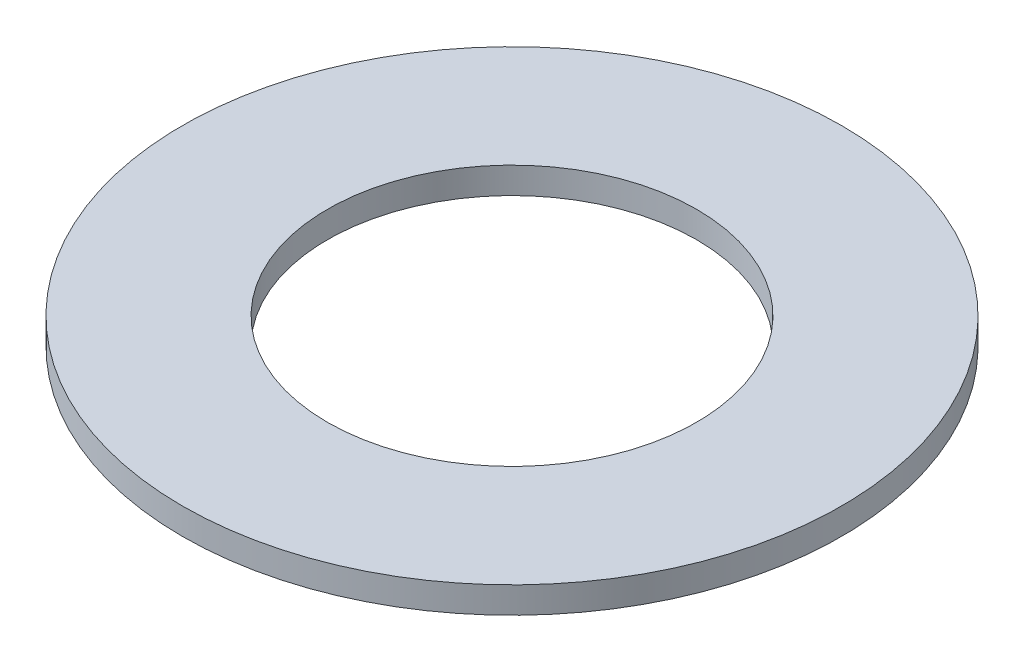
ISO-10303-21;
HEADER;
FILE_DESCRIPTION(('STEP AP214'),'2;1');
FILE_NAME('part.step','',(''),(''),'','','');
FILE_SCHEMA(('AUTOMOTIVE_DESIGN { 1 0 10303 214 1 1 1 1 }'));
ENDSEC;
DATA;
#1=APPLICATION_CONTEXT('core data for automotive mechanical design processes');
#2=APPLICATION_PROTOCOL_DEFINITION('international standard','automotive_design',2000,#1);
#3=PRODUCT_CONTEXT('',#1,'mechanical');
#4=PRODUCT('Part','Part','',(#3));
#5=PRODUCT_RELATED_PRODUCT_CATEGORY('part','',(#4));
#6=PRODUCT_DEFINITION_FORMATION('','',#4);
#7=PRODUCT_DEFINITION_CONTEXT('part definition',#1,'design');
#8=PRODUCT_DEFINITION('design','',#6,#7);
#9=PRODUCT_DEFINITION_SHAPE('','',#8);
#10=(LENGTH_UNIT() NAMED_UNIT(*) SI_UNIT(.MILLI.,.METRE.));
#11=(NAMED_UNIT(*) PLANE_ANGLE_UNIT() SI_UNIT($,.RADIAN.));
#12=(NAMED_UNIT(*) SI_UNIT($,.STERADIAN.) SOLID_ANGLE_UNIT());
#13=UNCERTAINTY_MEASURE_WITH_UNIT(LENGTH_MEASURE(1.E-05),#10,'distance_accuracy_value','');
#14=(GEOMETRIC_REPRESENTATION_CONTEXT(3) GLOBAL_UNCERTAINTY_ASSIGNED_CONTEXT((#13)) GLOBAL_UNIT_ASSIGNED_CONTEXT((#10,
#11,#12)) REPRESENTATION_CONTEXT('',''));
#15=CARTESIAN_POINT('',(0.,0.,0.));
#16=DIRECTION('',(0.,0.,1.));
#17=DIRECTION('',(1.,0.,0.));
#18=AXIS2_PLACEMENT_3D('',#15,#16,#17);
#19=CARTESIAN_POINT('',(0.,2.,0.));
#20=DIRECTION('',(0.,-1.,0.));
#21=DIRECTION('',(0.,0.,-1.));
#22=AXIS2_PLACEMENT_3D('',#19,#20,#21);
#23=CYLINDRICAL_SURFACE('',#22,25.);
#24=CARTESIAN_POINT('',(0.,2.,0.));
#25=DIRECTION('',(0.,1.,0.));
#26=DIRECTION('',(0.,0.,1.));
#27=AXIS2_PLACEMENT_3D('',#24,#25,#26);
#28=CIRCLE('',#27,25.);
#29=CARTESIAN_POINT('',(0.,2.,25.));
#30=VERTEX_POINT('',#29);
#31=EDGE_CURVE('E10',#30,#30,#28,.T.);
#32=ORIENTED_EDGE('',*,*,#31,.F.);
#33=EDGE_LOOP('',(#32));
#34=FACE_BOUND('',#33,.T.);
#35=CARTESIAN_POINT('',(0.,0.,0.));
#36=DIRECTION('',(0.,1.,0.));
#37=DIRECTION('',(0.,0.,1.));
#38=AXIS2_PLACEMENT_3D('',#35,#36,#37);
#39=CIRCLE('',#38,25.);
#40=CARTESIAN_POINT('',(0.,0.,25.));
#41=VERTEX_POINT('',#40);
#42=EDGE_CURVE('E40',#41,#41,#39,.T.);
#43=ORIENTED_EDGE('',*,*,#42,.T.);
#44=EDGE_LOOP('',(#43));
#45=FACE_BOUND('',#44,.T.);
#46=ADVANCED_FACE('F37',(#34,#45),#23,.T.);
#47=CARTESIAN_POINT('',(0.,2.,0.));
#48=DIRECTION('',(0.,1.,0.));
#49=DIRECTION('',(0.,0.,1.));
#50=AXIS2_PLACEMENT_3D('',#47,#48,#49);
#51=PLANE('',#50);
#52=CARTESIAN_POINT('',(0.,2.,0.));
#53=DIRECTION('',(0.,1.,0.));
#54=DIRECTION('',(0.,0.,1.));
#55=AXIS2_PLACEMENT_3D('',#52,#53,#54);
#56=CIRCLE('',#55,14.);
#57=CARTESIAN_POINT('',(0.,2.,14.));
#58=VERTEX_POINT('',#57);
#59=EDGE_CURVE('E51',#58,#58,#56,.T.);
#60=ORIENTED_EDGE('',*,*,#59,.F.);
#61=EDGE_LOOP('',(#60));
#62=FACE_BOUND('',#61,.T.);
#63=ORIENTED_EDGE('',*,*,#31,.T.);
#64=EDGE_LOOP('',(#63));
#65=FACE_BOUND('',#64,.T.);
#66=ADVANCED_FACE('F68',(#62,#65),#51,.T.);
#67=CARTESIAN_POINT('',(0.,0.,0.));
#68=DIRECTION('',(0.,1.,0.));
#69=DIRECTION('',(0.,0.,1.));
#70=AXIS2_PLACEMENT_3D('',#67,#68,#69);
#71=PLANE('',#70);
#72=CARTESIAN_POINT('',(0.,0.,0.));
#73=DIRECTION('',(0.,1.,0.));
#74=DIRECTION('',(0.,0.,1.));
#75=AXIS2_PLACEMENT_3D('',#72,#73,#74);
#76=CIRCLE('',#75,14.);
#77=CARTESIAN_POINT('',(0.,0.,14.));
#78=VERTEX_POINT('',#77);
#79=EDGE_CURVE('E49',#78,#78,#76,.T.);
#80=ORIENTED_EDGE('',*,*,#79,.T.);
#81=EDGE_LOOP('',(#80));
#82=FACE_BOUND('',#81,.T.);
#83=ORIENTED_EDGE('',*,*,#42,.F.);
#84=EDGE_LOOP('',(#83));
#85=FACE_BOUND('',#84,.T.);
#86=ADVANCED_FACE('F59',(#82,#85),#71,.F.);
#87=CARTESIAN_POINT('',(0.,0.,0.));
#88=DIRECTION('',(0.,1.,0.));
#89=DIRECTION('',(0.,0.,1.));
#90=AXIS2_PLACEMENT_3D('',#87,#88,#89);
#91=CYLINDRICAL_SURFACE('',#90,14.);
#92=ORIENTED_EDGE('',*,*,#79,.F.);
#93=EDGE_LOOP('',(#92));
#94=FACE_BOUND('',#93,.T.);
#95=ORIENTED_EDGE('',*,*,#59,.T.);
#96=EDGE_LOOP('',(#95));
#97=FACE_BOUND('',#96,.T.);
#98=ADVANCED_FACE('F62',(#94,#97),#91,.F.);
#99=CLOSED_SHELL('',(#46,#66,#86,#98));
#100=MANIFOLD_SOLID_BREP('B2',#99);
#101=ADVANCED_BREP_SHAPE_REPRESENTATION('',(#18,#100),#14);
#102=SHAPE_DEFINITION_REPRESENTATION(#9,#101);
ENDSEC;
END-ISO-10303-21;
